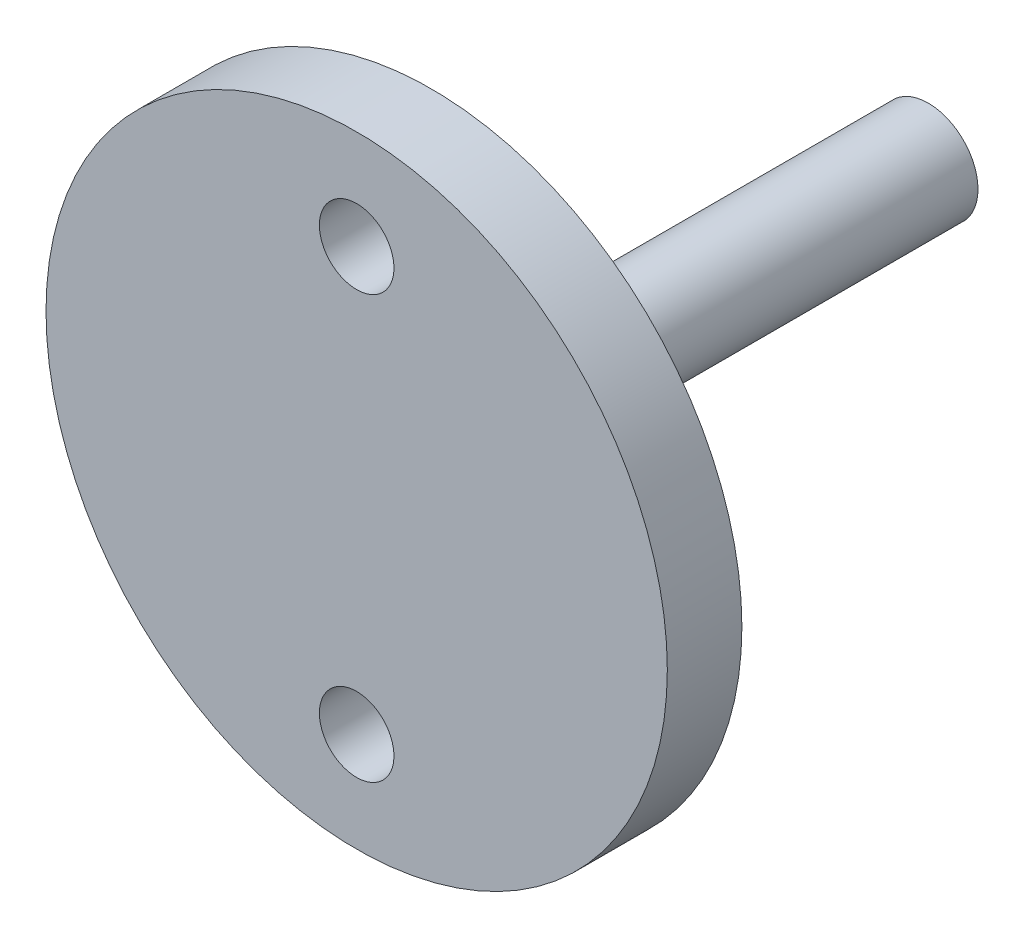
ISO-10303-21;
HEADER;
FILE_DESCRIPTION(('STEP AP214'),'2;1');
FILE_NAME('part.step','',(''),(''),'','','');
FILE_SCHEMA(('AUTOMOTIVE_DESIGN { 1 0 10303 214 1 1 1 1 }'));
ENDSEC;
DATA;
#1=APPLICATION_CONTEXT('core data for automotive mechanical design processes');
#2=APPLICATION_PROTOCOL_DEFINITION('international standard','automotive_design',2000,#1);
#3=PRODUCT_CONTEXT('',#1,'mechanical');
#4=PRODUCT('Part','Part','',(#3));
#5=PRODUCT_RELATED_PRODUCT_CATEGORY('part','',(#4));
#6=PRODUCT_DEFINITION_FORMATION('','',#4);
#7=PRODUCT_DEFINITION_CONTEXT('part definition',#1,'design');
#8=PRODUCT_DEFINITION('design','',#6,#7);
#9=PRODUCT_DEFINITION_SHAPE('','',#8);
#10=(LENGTH_UNIT() NAMED_UNIT(*) SI_UNIT(.MILLI.,.METRE.));
#11=(NAMED_UNIT(*) PLANE_ANGLE_UNIT() SI_UNIT($,.RADIAN.));
#12=(NAMED_UNIT(*) SI_UNIT($,.STERADIAN.) SOLID_ANGLE_UNIT());
#13=UNCERTAINTY_MEASURE_WITH_UNIT(LENGTH_MEASURE(1.E-05),#10,'distance_accuracy_value','');
#14=(GEOMETRIC_REPRESENTATION_CONTEXT(3) GLOBAL_UNCERTAINTY_ASSIGNED_CONTEXT((#13)) GLOBAL_UNIT_ASSIGNED_CONTEXT((#10,
#11,#12)) REPRESENTATION_CONTEXT('',''));
#15=CARTESIAN_POINT('',(0.,0.,0.));
#16=DIRECTION('',(0.,0.,1.));
#17=DIRECTION('',(1.,0.,0.));
#18=AXIS2_PLACEMENT_3D('',#15,#16,#17);
#19=CARTESIAN_POINT('',(0.,0.,3.));
#20=DIRECTION('',(0.,0.,-1.));
#21=DIRECTION('',(-1.,0.,0.));
#22=AXIS2_PLACEMENT_3D('',#19,#20,#21);
#23=CYLINDRICAL_SURFACE('',#22,12.5);
#24=CARTESIAN_POINT('',(0.,0.,3.));
#25=DIRECTION('',(0.,0.,1.));
#26=DIRECTION('',(1.,0.,0.));
#27=AXIS2_PLACEMENT_3D('',#24,#25,#26);
#28=CIRCLE('',#27,12.5);
#29=CARTESIAN_POINT('',(12.5,0.,3.));
#30=VERTEX_POINT('',#29);
#31=EDGE_CURVE('E50',#30,#30,#28,.T.);
#32=ORIENTED_EDGE('',*,*,#31,.F.);
#33=EDGE_LOOP('',(#32));
#34=FACE_BOUND('',#33,.T.);
#35=CARTESIAN_POINT('',(0.,0.,0.));
#36=DIRECTION('',(0.,0.,1.));
#37=DIRECTION('',(1.,0.,0.));
#38=AXIS2_PLACEMENT_3D('',#35,#36,#37);
#39=CIRCLE('',#38,12.5);
#40=CARTESIAN_POINT('',(12.5,0.,0.));
#41=VERTEX_POINT('',#40);
#42=EDGE_CURVE('E55',#41,#41,#39,.T.);
#43=ORIENTED_EDGE('',*,*,#42,.T.);
#44=EDGE_LOOP('',(#43));
#45=FACE_BOUND('',#44,.T.);
#46=ADVANCED_FACE('F43',(#34,#45),#23,.T.);
#47=CARTESIAN_POINT('',(0.,0.,3.));
#48=DIRECTION('',(0.,0.,1.));
#49=DIRECTION('',(1.,0.,0.));
#50=AXIS2_PLACEMENT_3D('',#47,#48,#49);
#51=PLANE('',#50);
#52=CARTESIAN_POINT('',(0.,8.5,3.));
#53=DIRECTION('',(0.,0.,-1.));
#54=DIRECTION('',(-1.,0.,0.));
#55=AXIS2_PLACEMENT_3D('',#52,#53,#54);
#56=CIRCLE('',#55,1.5);
#57=CARTESIAN_POINT('',(-1.5,8.5,3.));
#58=VERTEX_POINT('',#57);
#59=EDGE_CURVE('E61',#58,#58,#56,.T.);
#60=ORIENTED_EDGE('',*,*,#59,.T.);
#61=EDGE_LOOP('',(#60));
#62=FACE_BOUND('',#61,.T.);
#63=CARTESIAN_POINT('',(0.,-8.5,3.));
#64=DIRECTION('',(0.,0.,-1.));
#65=DIRECTION('',(-1.,0.,0.));
#66=AXIS2_PLACEMENT_3D('',#63,#64,#65);
#67=CIRCLE('',#66,1.5);
#68=CARTESIAN_POINT('',(-1.5,-8.5,3.));
#69=VERTEX_POINT('',#68);
#70=EDGE_CURVE('E63',#69,#69,#67,.T.);
#71=ORIENTED_EDGE('',*,*,#70,.T.);
#72=EDGE_LOOP('',(#71));
#73=FACE_BOUND('',#72,.T.);
#74=ORIENTED_EDGE('',*,*,#31,.T.);
#75=EDGE_LOOP('',(#74));
#76=FACE_BOUND('',#75,.T.);
#77=ADVANCED_FACE('F98',(#62,#73,#76),#51,.T.);
#78=CARTESIAN_POINT('',(0.,0.,0.));
#79=DIRECTION('',(0.,0.,1.));
#80=DIRECTION('',(1.,0.,0.));
#81=AXIS2_PLACEMENT_3D('',#78,#79,#80);
#82=PLANE('',#81);
#83=CARTESIAN_POINT('',(0.,0.,0.));
#84=DIRECTION('',(0.,0.,1.));
#85=DIRECTION('',(1.,0.,0.));
#86=AXIS2_PLACEMENT_3D('',#83,#84,#85);
#87=CIRCLE('',#86,2.);
#88=CARTESIAN_POINT('',(2.,0.,0.));
#89=VERTEX_POINT('',#88);
#90=EDGE_CURVE('E10',#89,#89,#87,.F.);
#91=ORIENTED_EDGE('',*,*,#90,.F.);
#92=EDGE_LOOP('',(#91));
#93=FACE_BOUND('',#92,.T.);
#94=CARTESIAN_POINT('',(0.,8.5,0.));
#95=DIRECTION('',(0.,0.,-1.));
#96=DIRECTION('',(-1.,0.,0.));
#97=AXIS2_PLACEMENT_3D('',#94,#95,#96);
#98=CIRCLE('',#97,1.5);
#99=CARTESIAN_POINT('',(-1.5,8.5,0.));
#100=VERTEX_POINT('',#99);
#101=EDGE_CURVE('E72',#100,#100,#98,.T.);
#102=ORIENTED_EDGE('',*,*,#101,.F.);
#103=EDGE_LOOP('',(#102));
#104=FACE_BOUND('',#103,.T.);
#105=CARTESIAN_POINT('',(0.,-8.5,0.));
#106=DIRECTION('',(0.,0.,-1.));
#107=DIRECTION('',(-1.,0.,0.));
#108=AXIS2_PLACEMENT_3D('',#105,#106,#107);
#109=CIRCLE('',#108,1.5);
#110=CARTESIAN_POINT('',(-1.5,-8.5,0.));
#111=VERTEX_POINT('',#110);
#112=EDGE_CURVE('E67',#111,#111,#109,.T.);
#113=ORIENTED_EDGE('',*,*,#112,.F.);
#114=EDGE_LOOP('',(#113));
#115=FACE_BOUND('',#114,.T.);
#116=ORIENTED_EDGE('',*,*,#42,.F.);
#117=EDGE_LOOP('',(#116));
#118=FACE_BOUND('',#117,.T.);
#119=ADVANCED_FACE('F103',(#93,#104,#115,#118),#82,.F.);
#120=CARTESIAN_POINT('',(0.,-8.5,3.));
#121=DIRECTION('',(0.,0.,-1.));
#122=DIRECTION('',(-1.,0.,0.));
#123=AXIS2_PLACEMENT_3D('',#120,#121,#122);
#124=CYLINDRICAL_SURFACE('',#123,1.5);
#125=ORIENTED_EDGE('',*,*,#70,.F.);
#126=EDGE_LOOP('',(#125));
#127=FACE_BOUND('',#126,.T.);
#128=ORIENTED_EDGE('',*,*,#112,.T.);
#129=EDGE_LOOP('',(#128));
#130=FACE_BOUND('',#129,.T.);
#131=ADVANCED_FACE('F94',(#127,#130),#124,.F.);
#132=CARTESIAN_POINT('',(0.,8.5,3.));
#133=DIRECTION('',(0.,0.,-1.));
#134=DIRECTION('',(-1.,0.,0.));
#135=AXIS2_PLACEMENT_3D('',#132,#133,#134);
#136=CYLINDRICAL_SURFACE('',#135,1.5);
#137=ORIENTED_EDGE('',*,*,#59,.F.);
#138=EDGE_LOOP('',(#137));
#139=FACE_BOUND('',#138,.T.);
#140=ORIENTED_EDGE('',*,*,#101,.T.);
#141=EDGE_LOOP('',(#140));
#142=FACE_BOUND('',#141,.T.);
#143=ADVANCED_FACE('F87',(#139,#142),#136,.F.);
#144=CARTESIAN_POINT('',(0.,0.,-20.));
#145=DIRECTION('',(0.,0.,1.));
#146=DIRECTION('',(1.,0.,0.));
#147=AXIS2_PLACEMENT_3D('',#144,#145,#146);
#148=CYLINDRICAL_SURFACE('',#147,2.);
#149=CARTESIAN_POINT('',(0.,0.,-20.));
#150=DIRECTION('',(0.,0.,-1.));
#151=DIRECTION('',(-1.,0.,0.));
#152=AXIS2_PLACEMENT_3D('',#149,#150,#151);
#153=CIRCLE('',#152,2.);
#154=CARTESIAN_POINT('',(-2.,0.,-20.));
#155=VERTEX_POINT('',#154);
#156=EDGE_CURVE('E68',#155,#155,#153,.T.);
#157=ORIENTED_EDGE('',*,*,#156,.F.);
#158=EDGE_LOOP('',(#157));
#159=FACE_BOUND('',#158,.T.);
#160=ORIENTED_EDGE('',*,*,#90,.T.);
#161=EDGE_LOOP('',(#160));
#162=FACE_BOUND('',#161,.T.);
#163=ADVANCED_FACE('F85',(#159,#162),#148,.T.);
#164=CARTESIAN_POINT('',(0.,0.,-20.));
#165=DIRECTION('',(0.,0.,-1.));
#166=DIRECTION('',(-1.,0.,0.));
#167=AXIS2_PLACEMENT_3D('',#164,#165,#166);
#168=PLANE('',#167);
#169=ORIENTED_EDGE('',*,*,#156,.T.);
#170=EDGE_LOOP('',(#169));
#171=FACE_BOUND('',#170,.T.);
#172=ADVANCED_FACE('F83',(#171),#168,.T.);
#173=CLOSED_SHELL('',(#46,#77,#119,#131,#143,#163,#172));
#174=MANIFOLD_SOLID_BREP('B2',#173);
#175=ADVANCED_BREP_SHAPE_REPRESENTATION('',(#18,#174),#14);
#176=SHAPE_DEFINITION_REPRESENTATION(#9,#175);
ENDSEC;
END-ISO-10303-21;
